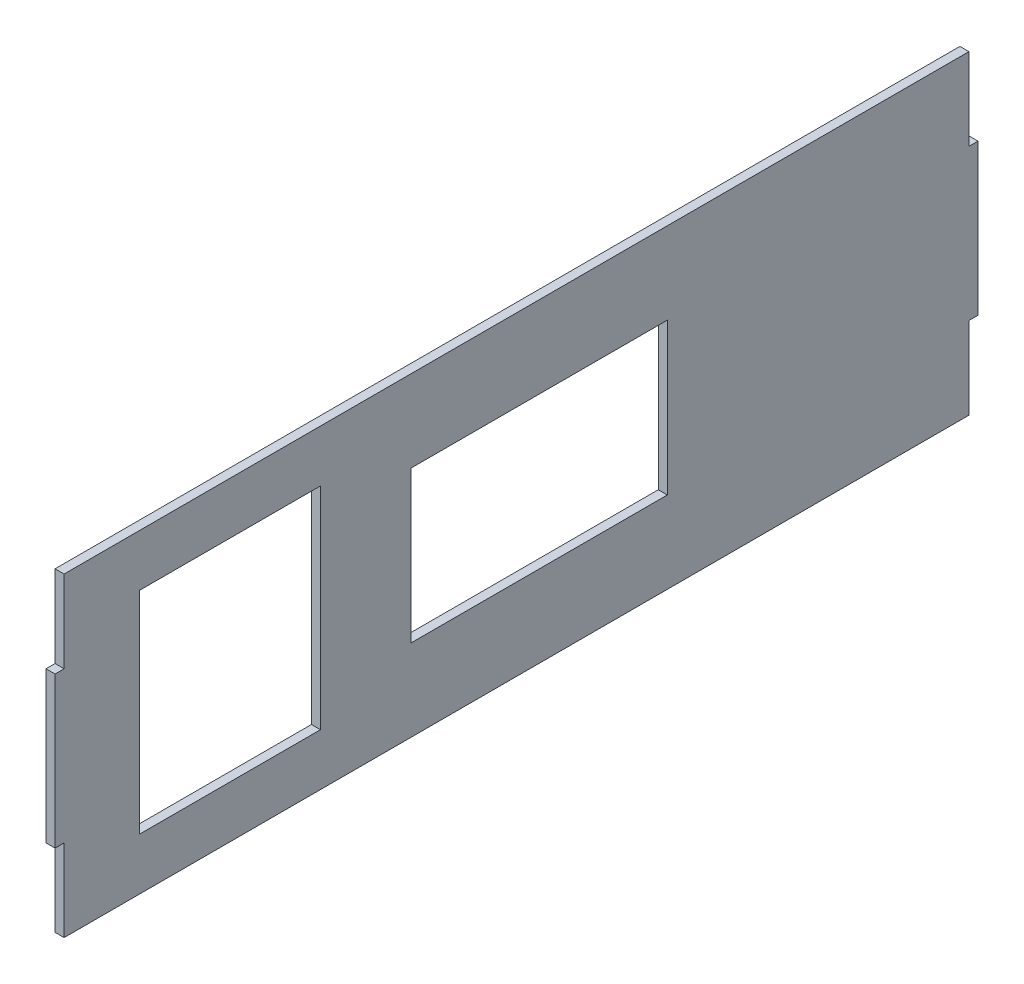
ISO-10303-21;
HEADER;
FILE_DESCRIPTION(('STEP AP214'),'2;1');
FILE_NAME('part.step','',(''),(''),'','','');
FILE_SCHEMA(('AUTOMOTIVE_DESIGN { 1 0 10303 214 1 1 1 1 }'));
ENDSEC;
DATA;
#1=APPLICATION_CONTEXT('core data for automotive mechanical design processes');
#2=APPLICATION_PROTOCOL_DEFINITION('international standard','automotive_design',2000,#1);
#3=PRODUCT_CONTEXT('',#1,'mechanical');
#4=PRODUCT('Part','Part','',(#3));
#5=PRODUCT_RELATED_PRODUCT_CATEGORY('part','',(#4));
#6=PRODUCT_DEFINITION_FORMATION('','',#4);
#7=PRODUCT_DEFINITION_CONTEXT('part definition',#1,'design');
#8=PRODUCT_DEFINITION('design','',#6,#7);
#9=PRODUCT_DEFINITION_SHAPE('','',#8);
#10=(LENGTH_UNIT() NAMED_UNIT(*) SI_UNIT(.MILLI.,.METRE.));
#11=(NAMED_UNIT(*) PLANE_ANGLE_UNIT() SI_UNIT($,.RADIAN.));
#12=(NAMED_UNIT(*) SI_UNIT($,.STERADIAN.) SOLID_ANGLE_UNIT());
#13=UNCERTAINTY_MEASURE_WITH_UNIT(LENGTH_MEASURE(1.E-05),#10,'distance_accuracy_value','');
#14=(GEOMETRIC_REPRESENTATION_CONTEXT(3) GLOBAL_UNCERTAINTY_ASSIGNED_CONTEXT((#13)) GLOBAL_UNIT_ASSIGNED_CONTEXT((#10,
#11,#12)) REPRESENTATION_CONTEXT('',''));
#15=CARTESIAN_POINT('',(0.,0.,0.));
#16=DIRECTION('',(0.,0.,1.));
#17=DIRECTION('',(1.,0.,0.));
#18=AXIS2_PLACEMENT_3D('',#15,#16,#17);
#19=CARTESIAN_POINT('',(3.,35.8717434869739,174.354709418838));
#20=DIRECTION('',(0.,0.,-1.));
#21=DIRECTION('',(-1.,0.,0.));
#22=AXIS2_PLACEMENT_3D('',#19,#20,#21);
#23=PLANE('',#22);
#24=DIRECTION('',(0.,-1.,0.));
#25=VECTOR('',#24,1.);
#26=CARTESIAN_POINT('',(0.,35.8717434869739,174.354709418838));
#27=LINE('',#26,#25);
#28=CARTESIAN_POINT('',(0.,63.0717434869739,174.354709418838));
#29=VERTEX_POINT('',#28);
#30=CARTESIAN_POINT('',(0.,35.8717434869739,174.354709418838));
#31=VERTEX_POINT('',#30);
#32=EDGE_CURVE('E209',#29,#31,#27,.T.);
#33=ORIENTED_EDGE('',*,*,#32,.T.);
#34=DIRECTION('',(-1.,0.,0.));
#35=VECTOR('',#34,1.);
#36=CARTESIAN_POINT('',(3.,35.8717434869739,174.354709418838));
#37=LINE('',#36,#35);
#38=CARTESIAN_POINT('',(3.,35.8717434869739,174.354709418838));
#39=VERTEX_POINT('',#38);
#40=EDGE_CURVE('E298',#39,#31,#37,.T.);
#41=ORIENTED_EDGE('',*,*,#40,.F.);
#42=DIRECTION('',(0.,-1.,0.));
#43=VECTOR('',#42,1.);
#44=CARTESIAN_POINT('',(3.,35.8717434869739,174.354709418838));
#45=LINE('',#44,#43);
#46=CARTESIAN_POINT('',(3.,63.0717434869739,174.354709418838));
#47=VERTEX_POINT('',#46);
#48=EDGE_CURVE('E216',#47,#39,#45,.T.);
#49=ORIENTED_EDGE('',*,*,#48,.F.);
#50=DIRECTION('',(-1.,0.,0.));
#51=VECTOR('',#50,1.);
#52=CARTESIAN_POINT('',(3.,63.0717434869739,174.354709418838));
#53=LINE('',#52,#51);
#54=EDGE_CURVE('E242',#47,#29,#53,.T.);
#55=ORIENTED_EDGE('',*,*,#54,.T.);
#56=EDGE_LOOP('',(#33,#41,#49,#55));
#57=FACE_BOUND('',#56,.T.);
#58=ADVANCED_FACE('F32',(#57),#23,.F.);
#59=CARTESIAN_POINT('',(3.,35.8717434869739,177.354709418838));
#60=DIRECTION('',(0.,-1.,0.));
#61=DIRECTION('',(0.,0.,-1.));
#62=AXIS2_PLACEMENT_3D('',#59,#60,#61);
#63=PLANE('',#62);
#64=DIRECTION('',(0.,0.,1.));
#65=VECTOR('',#64,1.);
#66=CARTESIAN_POINT('',(0.,35.8717434869739,177.354709418838));
#67=LINE('',#66,#65);
#68=CARTESIAN_POINT('',(0.,35.8717434869739,177.354709418838));
#69=VERTEX_POINT('',#68);
#70=EDGE_CURVE('E245',#31,#69,#67,.T.);
#71=ORIENTED_EDGE('',*,*,#70,.T.);
#72=DIRECTION('',(-1.,0.,0.));
#73=VECTOR('',#72,1.);
#74=CARTESIAN_POINT('',(3.,35.8717434869739,177.354709418838));
#75=LINE('',#74,#73);
#76=CARTESIAN_POINT('',(3.,35.8717434869739,177.354709418838));
#77=VERTEX_POINT('',#76);
#78=EDGE_CURVE('E295',#77,#69,#75,.T.);
#79=ORIENTED_EDGE('',*,*,#78,.F.);
#80=DIRECTION('',(0.,0.,1.));
#81=VECTOR('',#80,1.);
#82=CARTESIAN_POINT('',(3.,35.8717434869739,177.354709418838));
#83=LINE('',#82,#81);
#84=EDGE_CURVE('E219',#39,#77,#83,.T.);
#85=ORIENTED_EDGE('',*,*,#84,.F.);
#86=ORIENTED_EDGE('',*,*,#40,.T.);
#87=EDGE_LOOP('',(#71,#79,#85,#86));
#88=FACE_BOUND('',#87,.T.);
#89=ADVANCED_FACE('F335',(#88),#63,.F.);
#90=CARTESIAN_POINT('',(3.,-14.1282565130261,177.354709418838));
#91=DIRECTION('',(0.,0.,-1.));
#92=DIRECTION('',(-1.,0.,0.));
#93=AXIS2_PLACEMENT_3D('',#90,#91,#92);
#94=PLANE('',#93);
#95=DIRECTION('',(0.,-1.,0.));
#96=VECTOR('',#95,1.);
#97=CARTESIAN_POINT('',(0.,-14.1282565130261,177.354709418838));
#98=LINE('',#97,#96);
#99=CARTESIAN_POINT('',(0.,-14.1282565130261,177.354709418838));
#100=VERTEX_POINT('',#99);
#101=EDGE_CURVE('E247',#69,#100,#98,.T.);
#102=ORIENTED_EDGE('',*,*,#101,.T.);
#103=DIRECTION('',(-1.,0.,0.));
#104=VECTOR('',#103,1.);
#105=CARTESIAN_POINT('',(3.,-14.1282565130261,177.354709418838));
#106=LINE('',#105,#104);
#107=CARTESIAN_POINT('',(3.,-14.1282565130261,177.354709418838));
#108=VERTEX_POINT('',#107);
#109=EDGE_CURVE('E292',#108,#100,#106,.T.);
#110=ORIENTED_EDGE('',*,*,#109,.F.);
#111=DIRECTION('',(0.,-1.,0.));
#112=VECTOR('',#111,1.);
#113=CARTESIAN_POINT('',(3.,-14.1282565130261,177.354709418838));
#114=LINE('',#113,#112);
#115=EDGE_CURVE('E222',#77,#108,#114,.T.);
#116=ORIENTED_EDGE('',*,*,#115,.F.);
#117=ORIENTED_EDGE('',*,*,#78,.T.);
#118=EDGE_LOOP('',(#102,#110,#116,#117));
#119=FACE_BOUND('',#118,.T.);
#120=ADVANCED_FACE('F340',(#119),#94,.F.);
#121=CARTESIAN_POINT('',(3.,-14.1282565130261,174.354709418838));
#122=DIRECTION('',(0.,1.,0.));
#123=DIRECTION('',(0.,0.,1.));
#124=AXIS2_PLACEMENT_3D('',#121,#122,#123);
#125=PLANE('',#124);
#126=DIRECTION('',(0.,0.,-1.));
#127=VECTOR('',#126,1.);
#128=CARTESIAN_POINT('',(0.,-14.1282565130261,174.354709418838));
#129=LINE('',#128,#127);
#130=CARTESIAN_POINT('',(0.,-14.1282565130261,174.354709418838));
#131=VERTEX_POINT('',#130);
#132=EDGE_CURVE('E249',#100,#131,#129,.T.);
#133=ORIENTED_EDGE('',*,*,#132,.T.);
#134=DIRECTION('',(-1.,0.,0.));
#135=VECTOR('',#134,1.);
#136=CARTESIAN_POINT('',(3.,-14.1282565130261,174.354709418838));
#137=LINE('',#136,#135);
#138=CARTESIAN_POINT('',(3.,-14.1282565130261,174.354709418838));
#139=VERTEX_POINT('',#138);
#140=EDGE_CURVE('E289',#139,#131,#137,.T.);
#141=ORIENTED_EDGE('',*,*,#140,.F.);
#142=DIRECTION('',(0.,0.,-1.));
#143=VECTOR('',#142,1.);
#144=CARTESIAN_POINT('',(3.,-14.1282565130261,174.354709418838));
#145=LINE('',#144,#143);
#146=EDGE_CURVE('E224',#108,#139,#145,.T.);
#147=ORIENTED_EDGE('',*,*,#146,.F.);
#148=ORIENTED_EDGE('',*,*,#109,.T.);
#149=EDGE_LOOP('',(#133,#141,#147,#148));
#150=FACE_BOUND('',#149,.T.);
#151=ADVANCED_FACE('F393',(#150),#125,.F.);
#152=CARTESIAN_POINT('',(3.,-41.3282565130261,174.354709418838));
#153=DIRECTION('',(0.,0.,-1.));
#154=DIRECTION('',(-1.,0.,0.));
#155=AXIS2_PLACEMENT_3D('',#152,#153,#154);
#156=PLANE('',#155);
#157=DIRECTION('',(0.,-1.,0.));
#158=VECTOR('',#157,1.);
#159=CARTESIAN_POINT('',(0.,-41.3282565130261,174.354709418838));
#160=LINE('',#159,#158);
#161=CARTESIAN_POINT('',(0.,-41.3282565130261,174.354709418838));
#162=VERTEX_POINT('',#161);
#163=EDGE_CURVE('E251',#131,#162,#160,.T.);
#164=ORIENTED_EDGE('',*,*,#163,.T.);
#165=DIRECTION('',(-1.,0.,0.));
#166=VECTOR('',#165,1.);
#167=CARTESIAN_POINT('',(3.,-41.3282565130261,174.354709418838));
#168=LINE('',#167,#166);
#169=CARTESIAN_POINT('',(3.,-41.3282565130261,174.354709418838));
#170=VERTEX_POINT('',#169);
#171=EDGE_CURVE('E286',#170,#162,#168,.T.);
#172=ORIENTED_EDGE('',*,*,#171,.F.);
#173=DIRECTION('',(0.,-1.,0.));
#174=VECTOR('',#173,1.);
#175=CARTESIAN_POINT('',(3.,-41.3282565130261,174.354709418838));
#176=LINE('',#175,#174);
#177=EDGE_CURVE('E226',#139,#170,#176,.T.);
#178=ORIENTED_EDGE('',*,*,#177,.F.);
#179=ORIENTED_EDGE('',*,*,#140,.T.);
#180=EDGE_LOOP('',(#164,#172,#178,#179));
#181=FACE_BOUND('',#180,.T.);
#182=ADVANCED_FACE('F390',(#181),#156,.F.);
#183=CARTESIAN_POINT('',(3.,-41.328256513026,-125.645290581162));
#184=DIRECTION('',(0.,1.,0.));
#185=DIRECTION('',(0.,0.,1.));
#186=AXIS2_PLACEMENT_3D('',#183,#184,#185);
#187=PLANE('',#186);
#188=DIRECTION('',(0.,0.,-1.));
#189=VECTOR('',#188,1.);
#190=CARTESIAN_POINT('',(0.,-41.328256513026,-125.645290581162));
#191=LINE('',#190,#189);
#192=CARTESIAN_POINT('',(0.,-41.328256513026,-125.645290581162));
#193=VERTEX_POINT('',#192);
#194=EDGE_CURVE('E253',#162,#193,#191,.T.);
#195=ORIENTED_EDGE('',*,*,#194,.T.);
#196=DIRECTION('',(-1.,0.,0.));
#197=VECTOR('',#196,1.);
#198=CARTESIAN_POINT('',(3.,-41.328256513026,-125.645290581162));
#199=LINE('',#198,#197);
#200=CARTESIAN_POINT('',(3.,-41.328256513026,-125.645290581162));
#201=VERTEX_POINT('',#200);
#202=EDGE_CURVE('E283',#201,#193,#199,.T.);
#203=ORIENTED_EDGE('',*,*,#202,.F.);
#204=DIRECTION('',(0.,0.,-1.));
#205=VECTOR('',#204,1.);
#206=CARTESIAN_POINT('',(3.,-41.328256513026,-125.645290581162));
#207=LINE('',#206,#205);
#208=EDGE_CURVE('E228',#170,#201,#207,.T.);
#209=ORIENTED_EDGE('',*,*,#208,.F.);
#210=ORIENTED_EDGE('',*,*,#171,.T.);
#211=EDGE_LOOP('',(#195,#203,#209,#210));
#212=FACE_BOUND('',#211,.T.);
#213=ADVANCED_FACE('F386',(#212),#187,.F.);
#214=CARTESIAN_POINT('',(3.,-14.1282565130261,-125.645290581162));
#215=DIRECTION('',(0.,0.,1.));
#216=DIRECTION('',(1.,0.,0.));
#217=AXIS2_PLACEMENT_3D('',#214,#215,#216);
#218=PLANE('',#217);
#219=DIRECTION('',(0.,1.,0.));
#220=VECTOR('',#219,1.);
#221=CARTESIAN_POINT('',(0.,-14.1282565130261,-125.645290581162));
#222=LINE('',#221,#220);
#223=CARTESIAN_POINT('',(0.,-14.1282565130261,-125.645290581162));
#224=VERTEX_POINT('',#223);
#225=EDGE_CURVE('E255',#193,#224,#222,.T.);
#226=ORIENTED_EDGE('',*,*,#225,.T.);
#227=DIRECTION('',(-1.,0.,0.));
#228=VECTOR('',#227,1.);
#229=CARTESIAN_POINT('',(3.,-14.1282565130261,-125.645290581162));
#230=LINE('',#229,#228);
#231=CARTESIAN_POINT('',(3.,-14.1282565130261,-125.645290581162));
#232=VERTEX_POINT('',#231);
#233=EDGE_CURVE('E280',#232,#224,#230,.T.);
#234=ORIENTED_EDGE('',*,*,#233,.F.);
#235=DIRECTION('',(0.,1.,0.));
#236=VECTOR('',#235,1.);
#237=CARTESIAN_POINT('',(3.,-14.1282565130261,-125.645290581162));
#238=LINE('',#237,#236);
#239=EDGE_CURVE('E230',#201,#232,#238,.T.);
#240=ORIENTED_EDGE('',*,*,#239,.F.);
#241=ORIENTED_EDGE('',*,*,#202,.T.);
#242=EDGE_LOOP('',(#226,#234,#240,#241));
#243=FACE_BOUND('',#242,.T.);
#244=ADVANCED_FACE('F381',(#243),#218,.F.);
#245=CARTESIAN_POINT('',(3.,-14.1282565130261,-128.645290581162));
#246=DIRECTION('',(0.,1.,0.));
#247=DIRECTION('',(0.,0.,1.));
#248=AXIS2_PLACEMENT_3D('',#245,#246,#247);
#249=PLANE('',#248);
#250=DIRECTION('',(0.,0.,-1.));
#251=VECTOR('',#250,1.);
#252=CARTESIAN_POINT('',(0.,-14.1282565130261,-128.645290581162));
#253=LINE('',#252,#251);
#254=CARTESIAN_POINT('',(0.,-14.1282565130261,-128.645290581162));
#255=VERTEX_POINT('',#254);
#256=EDGE_CURVE('E257',#224,#255,#253,.T.);
#257=ORIENTED_EDGE('',*,*,#256,.T.);
#258=DIRECTION('',(-1.,0.,0.));
#259=VECTOR('',#258,1.);
#260=CARTESIAN_POINT('',(3.,-14.1282565130261,-128.645290581162));
#261=LINE('',#260,#259);
#262=CARTESIAN_POINT('',(3.,-14.1282565130261,-128.645290581162));
#263=VERTEX_POINT('',#262);
#264=EDGE_CURVE('E277',#263,#255,#261,.T.);
#265=ORIENTED_EDGE('',*,*,#264,.F.);
#266=DIRECTION('',(0.,0.,-1.));
#267=VECTOR('',#266,1.);
#268=CARTESIAN_POINT('',(3.,-14.1282565130261,-128.645290581162));
#269=LINE('',#268,#267);
#270=EDGE_CURVE('E232',#232,#263,#269,.T.);
#271=ORIENTED_EDGE('',*,*,#270,.F.);
#272=ORIENTED_EDGE('',*,*,#233,.T.);
#273=EDGE_LOOP('',(#257,#265,#271,#272));
#274=FACE_BOUND('',#273,.T.);
#275=ADVANCED_FACE('F375',(#274),#249,.F.);
#276=CARTESIAN_POINT('',(3.,35.8717434869739,-128.645290581162));
#277=DIRECTION('',(0.,0.,1.));
#278=DIRECTION('',(1.,0.,0.));
#279=AXIS2_PLACEMENT_3D('',#276,#277,#278);
#280=PLANE('',#279);
#281=DIRECTION('',(0.,1.,0.));
#282=VECTOR('',#281,1.);
#283=CARTESIAN_POINT('',(0.,35.8717434869739,-128.645290581162));
#284=LINE('',#283,#282);
#285=CARTESIAN_POINT('',(0.,35.8717434869739,-128.645290581162));
#286=VERTEX_POINT('',#285);
#287=EDGE_CURVE('E259',#255,#286,#284,.T.);
#288=ORIENTED_EDGE('',*,*,#287,.T.);
#289=DIRECTION('',(-1.,0.,0.));
#290=VECTOR('',#289,1.);
#291=CARTESIAN_POINT('',(3.,35.8717434869739,-128.645290581162));
#292=LINE('',#291,#290);
#293=CARTESIAN_POINT('',(3.,35.8717434869739,-128.645290581162));
#294=VERTEX_POINT('',#293);
#295=EDGE_CURVE('E274',#294,#286,#292,.T.);
#296=ORIENTED_EDGE('',*,*,#295,.F.);
#297=DIRECTION('',(0.,1.,0.));
#298=VECTOR('',#297,1.);
#299=CARTESIAN_POINT('',(3.,35.8717434869739,-128.645290581162));
#300=LINE('',#299,#298);
#301=EDGE_CURVE('E234',#263,#294,#300,.T.);
#302=ORIENTED_EDGE('',*,*,#301,.F.);
#303=ORIENTED_EDGE('',*,*,#264,.T.);
#304=EDGE_LOOP('',(#288,#296,#302,#303));
#305=FACE_BOUND('',#304,.T.);
#306=ADVANCED_FACE('F371',(#305),#280,.F.);
#307=CARTESIAN_POINT('',(3.,35.8717434869739,-125.645290581162));
#308=DIRECTION('',(0.,-1.,0.));
#309=DIRECTION('',(0.,0.,-1.));
#310=AXIS2_PLACEMENT_3D('',#307,#308,#309);
#311=PLANE('',#310);
#312=DIRECTION('',(0.,0.,1.));
#313=VECTOR('',#312,1.);
#314=CARTESIAN_POINT('',(0.,35.8717434869739,-125.645290581162));
#315=LINE('',#314,#313);
#316=CARTESIAN_POINT('',(0.,35.8717434869739,-125.645290581162));
#317=VERTEX_POINT('',#316);
#318=EDGE_CURVE('E261',#286,#317,#315,.T.);
#319=ORIENTED_EDGE('',*,*,#318,.T.);
#320=DIRECTION('',(-1.,0.,0.));
#321=VECTOR('',#320,1.);
#322=CARTESIAN_POINT('',(3.,35.8717434869739,-125.645290581162));
#323=LINE('',#322,#321);
#324=CARTESIAN_POINT('',(3.,35.8717434869739,-125.645290581162));
#325=VERTEX_POINT('',#324);
#326=EDGE_CURVE('E271',#325,#317,#323,.T.);
#327=ORIENTED_EDGE('',*,*,#326,.F.);
#328=DIRECTION('',(0.,0.,1.));
#329=VECTOR('',#328,1.);
#330=CARTESIAN_POINT('',(3.,35.8717434869739,-125.645290581162));
#331=LINE('',#330,#329);
#332=EDGE_CURVE('E236',#294,#325,#331,.T.);
#333=ORIENTED_EDGE('',*,*,#332,.F.);
#334=ORIENTED_EDGE('',*,*,#295,.T.);
#335=EDGE_LOOP('',(#319,#327,#333,#334));
#336=FACE_BOUND('',#335,.T.);
#337=ADVANCED_FACE('F366',(#336),#311,.F.);
#338=CARTESIAN_POINT('',(3.,63.0717434869739,-125.645290581162));
#339=DIRECTION('',(0.,0.,1.));
#340=DIRECTION('',(1.,0.,0.));
#341=AXIS2_PLACEMENT_3D('',#338,#339,#340);
#342=PLANE('',#341);
#343=DIRECTION('',(0.,1.,0.));
#344=VECTOR('',#343,1.);
#345=CARTESIAN_POINT('',(0.,63.0717434869739,-125.645290581162));
#346=LINE('',#345,#344);
#347=CARTESIAN_POINT('',(0.,63.0717434869739,-125.645290581162));
#348=VERTEX_POINT('',#347);
#349=EDGE_CURVE('E263',#317,#348,#346,.T.);
#350=ORIENTED_EDGE('',*,*,#349,.T.);
#351=DIRECTION('',(-1.,0.,0.));
#352=VECTOR('',#351,1.);
#353=CARTESIAN_POINT('',(3.,63.0717434869739,-125.645290581162));
#354=LINE('',#353,#352);
#355=CARTESIAN_POINT('',(3.,63.0717434869739,-125.645290581162));
#356=VERTEX_POINT('',#355);
#357=EDGE_CURVE('E268',#356,#348,#354,.T.);
#358=ORIENTED_EDGE('',*,*,#357,.F.);
#359=DIRECTION('',(0.,1.,0.));
#360=VECTOR('',#359,1.);
#361=CARTESIAN_POINT('',(3.,63.0717434869739,-125.645290581162));
#362=LINE('',#361,#360);
#363=EDGE_CURVE('E238',#325,#356,#362,.T.);
#364=ORIENTED_EDGE('',*,*,#363,.F.);
#365=ORIENTED_EDGE('',*,*,#326,.T.);
#366=EDGE_LOOP('',(#350,#358,#364,#365));
#367=FACE_BOUND('',#366,.T.);
#368=ADVANCED_FACE('F360',(#367),#342,.F.);
#369=CARTESIAN_POINT('',(3.,63.0717434869739,174.354709418838));
#370=DIRECTION('',(0.,-1.,0.));
#371=DIRECTION('',(0.,0.,-1.));
#372=AXIS2_PLACEMENT_3D('',#369,#370,#371);
#373=PLANE('',#372);
#374=DIRECTION('',(0.,0.,1.));
#375=VECTOR('',#374,1.);
#376=CARTESIAN_POINT('',(0.,63.0717434869739,174.354709418838));
#377=LINE('',#376,#375);
#378=EDGE_CURVE('E220',#348,#29,#377,.T.);
#379=ORIENTED_EDGE('',*,*,#378,.T.);
#380=ORIENTED_EDGE('',*,*,#54,.F.);
#381=DIRECTION('',(0.,0.,1.));
#382=VECTOR('',#381,1.);
#383=CARTESIAN_POINT('',(3.,63.0717434869739,174.354709418838));
#384=LINE('',#383,#382);
#385=EDGE_CURVE('E240',#356,#47,#384,.T.);
#386=ORIENTED_EDGE('',*,*,#385,.F.);
#387=ORIENTED_EDGE('',*,*,#357,.T.);
#388=EDGE_LOOP('',(#379,#380,#386,#387));
#389=FACE_BOUND('',#388,.T.);
#390=ADVANCED_FACE('F358',(#389),#373,.F.);
#391=CARTESIAN_POINT('',(3.,0.,0.));
#392=DIRECTION('',(-1.,0.,0.));
#393=DIRECTION('',(0.,0.,1.));
#394=AXIS2_PLACEMENT_3D('',#391,#392,#393);
#395=PLANE('',#394);
#396=DIRECTION('',(0.,0.,-1.));
#397=VECTOR('',#396,1.);
#398=CARTESIAN_POINT('',(3.,-14.2282565130261,59.3547094188376));
#399=LINE('',#398,#397);
#400=CARTESIAN_POINT('',(3.,-14.2282565130261,59.3547094188376));
#401=VERTEX_POINT('',#400);
#402=CARTESIAN_POINT('',(3.,-14.2282565130261,-25.6452905811624));
#403=VERTEX_POINT('',#402);
#404=EDGE_CURVE('E179',#401,#403,#399,.T.);
#405=ORIENTED_EDGE('',*,*,#404,.F.);
#406=DIRECTION('',(0.,-1.,0.));
#407=VECTOR('',#406,1.);
#408=CARTESIAN_POINT('',(3.,35.9717434869739,59.3547094188376));
#409=LINE('',#408,#407);
#410=CARTESIAN_POINT('',(3.,35.9717434869739,59.3547094188376));
#411=VERTEX_POINT('',#410);
#412=EDGE_CURVE('E46',#411,#401,#409,.T.);
#413=ORIENTED_EDGE('',*,*,#412,.F.);
#414=DIRECTION('',(0.,0.,1.));
#415=VECTOR('',#414,1.);
#416=CARTESIAN_POINT('',(3.,35.9717434869739,59.3547094188376));
#417=LINE('',#416,#415);
#418=CARTESIAN_POINT('',(3.,35.9717434869739,-25.6452905811624));
#419=VERTEX_POINT('',#418);
#420=EDGE_CURVE('E186',#419,#411,#417,.T.);
#421=ORIENTED_EDGE('',*,*,#420,.F.);
#422=DIRECTION('',(0.,1.,0.));
#423=VECTOR('',#422,1.);
#424=CARTESIAN_POINT('',(3.,35.9717434869739,-25.6452905811624));
#425=LINE('',#424,#423);
#426=EDGE_CURVE('E170',#403,#419,#425,.T.);
#427=ORIENTED_EDGE('',*,*,#426,.F.);
#428=EDGE_LOOP('',(#405,#413,#421,#427));
#429=FACE_BOUND('',#428,.T.);
#430=DIRECTION('',(0.,0.,-1.));
#431=VECTOR('',#430,1.);
#432=CARTESIAN_POINT('',(3.,-24.1282565130261,149.354709418838));
#433=LINE('',#432,#431);
#434=CARTESIAN_POINT('',(3.,-24.1282565130261,149.354709418838));
#435=VERTEX_POINT('',#434);
#436=CARTESIAN_POINT('',(3.,-24.1282565130261,89.3547094188376));
#437=VERTEX_POINT('',#436);
#438=EDGE_CURVE('E197',#435,#437,#433,.T.);
#439=ORIENTED_EDGE('',*,*,#438,.F.);
#440=DIRECTION('',(0.,-1.,0.));
#441=VECTOR('',#440,1.);
#442=CARTESIAN_POINT('',(3.,45.8717434869739,149.354709418838));
#443=LINE('',#442,#441);
#444=CARTESIAN_POINT('',(3.,45.8717434869739,149.354709418838));
#445=VERTEX_POINT('',#444);
#446=EDGE_CURVE('E193',#445,#435,#443,.T.);
#447=ORIENTED_EDGE('',*,*,#446,.F.);
#448=DIRECTION('',(0.,0.,1.));
#449=VECTOR('',#448,1.);
#450=CARTESIAN_POINT('',(3.,45.8717434869739,149.354709418838));
#451=LINE('',#450,#449);
#452=CARTESIAN_POINT('',(3.,45.8717434869739,89.3547094188376));
#453=VERTEX_POINT('',#452);
#454=EDGE_CURVE('E203',#453,#445,#451,.T.);
#455=ORIENTED_EDGE('',*,*,#454,.F.);
#456=DIRECTION('',(0.,1.,0.));
#457=VECTOR('',#456,1.);
#458=CARTESIAN_POINT('',(3.,45.8717434869739,89.3547094188376));
#459=LINE('',#458,#457);
#460=EDGE_CURVE('E200',#437,#453,#459,.T.);
#461=ORIENTED_EDGE('',*,*,#460,.F.);
#462=EDGE_LOOP('',(#439,#447,#455,#461));
#463=FACE_BOUND('',#462,.T.);
#464=ORIENTED_EDGE('',*,*,#48,.T.);
#465=ORIENTED_EDGE('',*,*,#84,.T.);
#466=ORIENTED_EDGE('',*,*,#115,.T.);
#467=ORIENTED_EDGE('',*,*,#146,.T.);
#468=ORIENTED_EDGE('',*,*,#177,.T.);
#469=ORIENTED_EDGE('',*,*,#208,.T.);
#470=ORIENTED_EDGE('',*,*,#239,.T.);
#471=ORIENTED_EDGE('',*,*,#270,.T.);
#472=ORIENTED_EDGE('',*,*,#301,.T.);
#473=ORIENTED_EDGE('',*,*,#332,.T.);
#474=ORIENTED_EDGE('',*,*,#363,.T.);
#475=ORIENTED_EDGE('',*,*,#385,.T.);
#476=EDGE_LOOP('',(#464,#465,#466,#467,#468,#469,#470,#471,#472,#473,#474,#475));
#477=FACE_BOUND('',#476,.T.);
#478=ADVANCED_FACE('F183',(#429,#463,#477),#395,.F.);
#479=CARTESIAN_POINT('',(0.,0.,0.));
#480=DIRECTION('',(-1.,0.,0.));
#481=DIRECTION('',(0.,0.,1.));
#482=AXIS2_PLACEMENT_3D('',#479,#480,#481);
#483=PLANE('',#482);
#484=DIRECTION('',(0.,1.,0.));
#485=VECTOR('',#484,1.);
#486=CARTESIAN_POINT('',(0.,0.,59.3547094188376));
#487=LINE('',#486,#485);
#488=CARTESIAN_POINT('',(0.,-14.2282565130261,59.3547094188376));
#489=VERTEX_POINT('',#488);
#490=CARTESIAN_POINT('',(0.,35.9717434869739,59.3547094188376));
#491=VERTEX_POINT('',#490);
#492=EDGE_CURVE('E11',#489,#491,#487,.T.);
#493=ORIENTED_EDGE('',*,*,#492,.F.);
#494=DIRECTION('',(0.,0.,1.));
#495=VECTOR('',#494,1.);
#496=CARTESIAN_POINT('',(0.,-14.2282565130261,0.));
#497=LINE('',#496,#495);
#498=CARTESIAN_POINT('',(0.,-14.2282565130261,-25.6452905811624));
#499=VERTEX_POINT('',#498);
#500=EDGE_CURVE('E310',#499,#489,#497,.T.);
#501=ORIENTED_EDGE('',*,*,#500,.F.);
#502=DIRECTION('',(0.,-1.,0.));
#503=VECTOR('',#502,1.);
#504=CARTESIAN_POINT('',(0.,0.,-25.6452905811624));
#505=LINE('',#504,#503);
#506=CARTESIAN_POINT('',(0.,35.9717434869739,-25.6452905811624));
#507=VERTEX_POINT('',#506);
#508=EDGE_CURVE('E173',#507,#499,#505,.T.);
#509=ORIENTED_EDGE('',*,*,#508,.F.);
#510=DIRECTION('',(0.,0.,-1.));
#511=VECTOR('',#510,1.);
#512=CARTESIAN_POINT('',(0.,35.9717434869739,0.));
#513=LINE('',#512,#511);
#514=EDGE_CURVE('E39',#491,#507,#513,.T.);
#515=ORIENTED_EDGE('',*,*,#514,.F.);
#516=EDGE_LOOP('',(#493,#501,#509,#515));
#517=FACE_BOUND('',#516,.T.);
#518=DIRECTION('',(0.,1.,0.));
#519=VECTOR('',#518,1.);
#520=CARTESIAN_POINT('',(0.,0.,149.354709418838));
#521=LINE('',#520,#519);
#522=CARTESIAN_POINT('',(0.,-24.1282565130261,149.354709418838));
#523=VERTEX_POINT('',#522);
#524=CARTESIAN_POINT('',(0.,45.8717434869739,149.354709418838));
#525=VERTEX_POINT('',#524);
#526=EDGE_CURVE('E308',#523,#525,#521,.T.);
#527=ORIENTED_EDGE('',*,*,#526,.F.);
#528=DIRECTION('',(0.,0.,1.));
#529=VECTOR('',#528,1.);
#530=CARTESIAN_POINT('',(0.,-24.1282565130261,0.));
#531=LINE('',#530,#529);
#532=CARTESIAN_POINT('',(0.,-24.1282565130261,89.3547094188376));
#533=VERTEX_POINT('',#532);
#534=EDGE_CURVE('E301',#533,#523,#531,.T.);
#535=ORIENTED_EDGE('',*,*,#534,.F.);
#536=DIRECTION('',(0.,-1.,0.));
#537=VECTOR('',#536,1.);
#538=CARTESIAN_POINT('',(0.,0.,89.3547094188376));
#539=LINE('',#538,#537);
#540=CARTESIAN_POINT('',(0.,45.8717434869739,89.3547094188376));
#541=VERTEX_POINT('',#540);
#542=EDGE_CURVE('E303',#541,#533,#539,.T.);
#543=ORIENTED_EDGE('',*,*,#542,.F.);
#544=DIRECTION('',(0.,0.,-1.));
#545=VECTOR('',#544,1.);
#546=CARTESIAN_POINT('',(0.,45.8717434869739,0.));
#547=LINE('',#546,#545);
#548=EDGE_CURVE('E306',#525,#541,#547,.T.);
#549=ORIENTED_EDGE('',*,*,#548,.F.);
#550=EDGE_LOOP('',(#527,#535,#543,#549));
#551=FACE_BOUND('',#550,.T.);
#552=ORIENTED_EDGE('',*,*,#32,.F.);
#553=ORIENTED_EDGE('',*,*,#378,.F.);
#554=ORIENTED_EDGE('',*,*,#349,.F.);
#555=ORIENTED_EDGE('',*,*,#318,.F.);
#556=ORIENTED_EDGE('',*,*,#287,.F.);
#557=ORIENTED_EDGE('',*,*,#256,.F.);
#558=ORIENTED_EDGE('',*,*,#225,.F.);
#559=ORIENTED_EDGE('',*,*,#194,.F.);
#560=ORIENTED_EDGE('',*,*,#163,.F.);
#561=ORIENTED_EDGE('',*,*,#132,.F.);
#562=ORIENTED_EDGE('',*,*,#101,.F.);
#563=ORIENTED_EDGE('',*,*,#70,.F.);
#564=EDGE_LOOP('',(#552,#553,#554,#555,#556,#557,#558,#559,#560,#561,#562,#563));
#565=FACE_BOUND('',#564,.T.);
#566=ADVANCED_FACE('F318',(#517,#551,#565),#483,.T.);
#567=CARTESIAN_POINT('',(-7.,45.8717434869739,149.354709418838));
#568=DIRECTION('',(0.,0.,1.));
#569=DIRECTION('',(0.,-1.,0.));
#570=AXIS2_PLACEMENT_3D('',#567,#568,#569);
#571=PLANE('',#570);
#572=ORIENTED_EDGE('',*,*,#526,.T.);
#573=DIRECTION('',(1.,0.,0.));
#574=VECTOR('',#573,1.);
#575=CARTESIAN_POINT('',(-7.,45.8717434869739,149.354709418838));
#576=LINE('',#575,#574);
#577=EDGE_CURVE('E207',#525,#445,#576,.T.);
#578=ORIENTED_EDGE('',*,*,#577,.T.);
#579=ORIENTED_EDGE('',*,*,#446,.T.);
#580=DIRECTION('',(1.,0.,0.));
#581=VECTOR('',#580,1.);
#582=CARTESIAN_POINT('',(-7.,-24.1282565130261,149.354709418838));
#583=LINE('',#582,#581);
#584=EDGE_CURVE('E206',#523,#435,#583,.T.);
#585=ORIENTED_EDGE('',*,*,#584,.F.);
#586=EDGE_LOOP('',(#572,#578,#579,#585));
#587=FACE_BOUND('',#586,.T.);
#588=ADVANCED_FACE('F422',(#587),#571,.F.);
#589=CARTESIAN_POINT('',(-7.,45.8717434869739,149.354709418838));
#590=DIRECTION('',(0.,1.,0.));
#591=DIRECTION('',(0.,0.,1.));
#592=AXIS2_PLACEMENT_3D('',#589,#590,#591);
#593=PLANE('',#592);
#594=ORIENTED_EDGE('',*,*,#548,.T.);
#595=DIRECTION('',(1.,0.,0.));
#596=VECTOR('',#595,1.);
#597=CARTESIAN_POINT('',(-7.,45.8717434869739,89.3547094188376));
#598=LINE('',#597,#596);
#599=EDGE_CURVE('E210',#541,#453,#598,.T.);
#600=ORIENTED_EDGE('',*,*,#599,.T.);
#601=ORIENTED_EDGE('',*,*,#454,.T.);
#602=ORIENTED_EDGE('',*,*,#577,.F.);
#603=EDGE_LOOP('',(#594,#600,#601,#602));
#604=FACE_BOUND('',#603,.T.);
#605=ADVANCED_FACE('F426',(#604),#593,.F.);
#606=CARTESIAN_POINT('',(-7.,45.8717434869739,89.3547094188376));
#607=DIRECTION('',(0.,0.,-1.));
#608=DIRECTION('',(0.,1.,0.));
#609=AXIS2_PLACEMENT_3D('',#606,#607,#608);
#610=PLANE('',#609);
#611=ORIENTED_EDGE('',*,*,#542,.T.);
#612=DIRECTION('',(1.,0.,0.));
#613=VECTOR('',#612,1.);
#614=CARTESIAN_POINT('',(-7.,-24.1282565130261,89.3547094188376));
#615=LINE('',#614,#613);
#616=EDGE_CURVE('E212',#533,#437,#615,.T.);
#617=ORIENTED_EDGE('',*,*,#616,.T.);
#618=ORIENTED_EDGE('',*,*,#460,.T.);
#619=ORIENTED_EDGE('',*,*,#599,.F.);
#620=EDGE_LOOP('',(#611,#617,#618,#619));
#621=FACE_BOUND('',#620,.T.);
#622=ADVANCED_FACE('F329',(#621),#610,.F.);
#623=CARTESIAN_POINT('',(-7.,-24.1282565130261,149.354709418838));
#624=DIRECTION('',(0.,-1.,0.));
#625=DIRECTION('',(0.,0.,-1.));
#626=AXIS2_PLACEMENT_3D('',#623,#624,#625);
#627=PLANE('',#626);
#628=ORIENTED_EDGE('',*,*,#534,.T.);
#629=ORIENTED_EDGE('',*,*,#584,.T.);
#630=ORIENTED_EDGE('',*,*,#438,.T.);
#631=ORIENTED_EDGE('',*,*,#616,.F.);
#632=EDGE_LOOP('',(#628,#629,#630,#631));
#633=FACE_BOUND('',#632,.T.);
#634=ADVANCED_FACE('F322',(#633),#627,.F.);
#635=CARTESIAN_POINT('',(-7.,35.9717434869739,59.3547094188376));
#636=DIRECTION('',(0.,0.,1.));
#637=DIRECTION('',(0.,-1.,0.));
#638=AXIS2_PLACEMENT_3D('',#635,#636,#637);
#639=PLANE('',#638);
#640=ORIENTED_EDGE('',*,*,#492,.T.);
#641=DIRECTION('',(1.,0.,0.));
#642=VECTOR('',#641,1.);
#643=CARTESIAN_POINT('',(-7.,35.9717434869739,59.3547094188376));
#644=LINE('',#643,#642);
#645=EDGE_CURVE('E191',#491,#411,#644,.T.);
#646=ORIENTED_EDGE('',*,*,#645,.T.);
#647=ORIENTED_EDGE('',*,*,#412,.T.);
#648=DIRECTION('',(1.,0.,0.));
#649=VECTOR('',#648,1.);
#650=CARTESIAN_POINT('',(-7.,-14.2282565130261,59.3547094188376));
#651=LINE('',#650,#649);
#652=EDGE_CURVE('E176',#489,#401,#651,.T.);
#653=ORIENTED_EDGE('',*,*,#652,.F.);
#654=EDGE_LOOP('',(#640,#646,#647,#653));
#655=FACE_BOUND('',#654,.T.);
#656=ADVANCED_FACE('F320',(#655),#639,.F.);
#657=CARTESIAN_POINT('',(-7.,35.9717434869739,59.3547094188376));
#658=DIRECTION('',(0.,1.,0.));
#659=DIRECTION('',(0.,0.,1.));
#660=AXIS2_PLACEMENT_3D('',#657,#658,#659);
#661=PLANE('',#660);
#662=ORIENTED_EDGE('',*,*,#514,.T.);
#663=DIRECTION('',(1.,0.,0.));
#664=VECTOR('',#663,1.);
#665=CARTESIAN_POINT('',(-7.,35.9717434869739,-25.6452905811624));
#666=LINE('',#665,#664);
#667=EDGE_CURVE('E175',#507,#419,#666,.T.);
#668=ORIENTED_EDGE('',*,*,#667,.T.);
#669=ORIENTED_EDGE('',*,*,#420,.T.);
#670=ORIENTED_EDGE('',*,*,#645,.F.);
#671=EDGE_LOOP('',(#662,#668,#669,#670));
#672=FACE_BOUND('',#671,.T.);
#673=ADVANCED_FACE('F315',(#672),#661,.F.);
#674=CARTESIAN_POINT('',(-7.,35.9717434869739,-25.6452905811624));
#675=DIRECTION('',(0.,0.,-1.));
#676=DIRECTION('',(-1.,0.,0.));
#677=AXIS2_PLACEMENT_3D('',#674,#675,#676);
#678=PLANE('',#677);
#679=ORIENTED_EDGE('',*,*,#508,.T.);
#680=DIRECTION('',(1.,0.,0.));
#681=VECTOR('',#680,1.);
#682=CARTESIAN_POINT('',(-7.,-14.2282565130261,-25.6452905811624));
#683=LINE('',#682,#681);
#684=EDGE_CURVE('E54',#499,#403,#683,.T.);
#685=ORIENTED_EDGE('',*,*,#684,.T.);
#686=ORIENTED_EDGE('',*,*,#426,.T.);
#687=ORIENTED_EDGE('',*,*,#667,.F.);
#688=EDGE_LOOP('',(#679,#685,#686,#687));
#689=FACE_BOUND('',#688,.T.);
#690=ADVANCED_FACE('F167',(#689),#678,.F.);
#691=CARTESIAN_POINT('',(-7.,-14.2282565130261,59.3547094188376));
#692=DIRECTION('',(0.,-1.,0.));
#693=DIRECTION('',(0.,0.,-1.));
#694=AXIS2_PLACEMENT_3D('',#691,#692,#693);
#695=PLANE('',#694);
#696=ORIENTED_EDGE('',*,*,#500,.T.);
#697=ORIENTED_EDGE('',*,*,#652,.T.);
#698=ORIENTED_EDGE('',*,*,#404,.T.);
#699=ORIENTED_EDGE('',*,*,#684,.F.);
#700=EDGE_LOOP('',(#696,#697,#698,#699));
#701=FACE_BOUND('',#700,.T.);
#702=ADVANCED_FACE('F180',(#701),#695,.F.);
#703=CLOSED_SHELL('',(#58,#89,#120,#151,#182,#213,#244,#275,#306,#337,#368,#390,#478,#566,#588,
#605,#622,#634,#656,#673,#690,#702));
#704=MANIFOLD_SOLID_BREP('B2',#703);
#705=ADVANCED_BREP_SHAPE_REPRESENTATION('',(#18,#704),#14);
#706=SHAPE_DEFINITION_REPRESENTATION(#9,#705);
ENDSEC;
END-ISO-10303-21;
